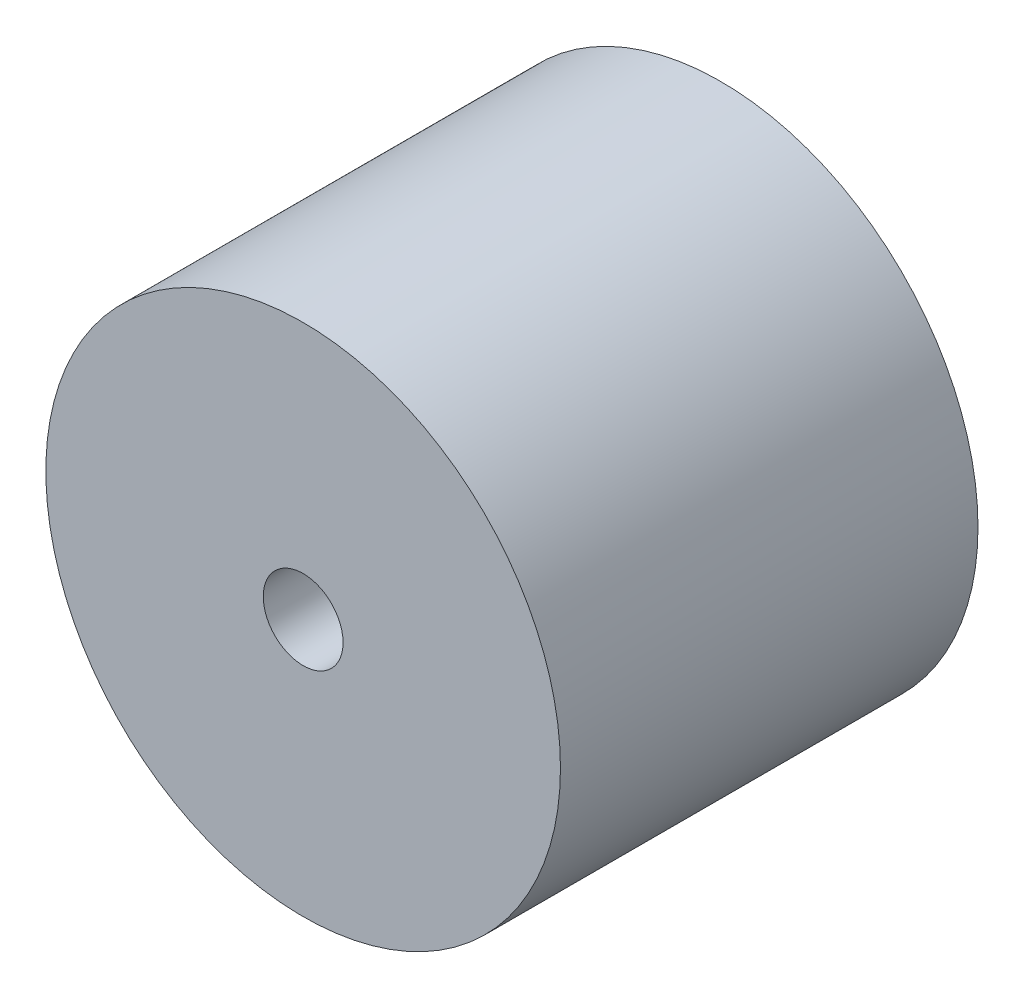
ISO-10303-21;
HEADER;
FILE_DESCRIPTION(('STEP AP214'),'2;1');
FILE_NAME('part.step','',(''),(''),'','','');
FILE_SCHEMA(('AUTOMOTIVE_DESIGN { 1 0 10303 214 1 1 1 1 }'));
ENDSEC;
DATA;
#1=APPLICATION_CONTEXT('core data for automotive mechanical design processes');
#2=APPLICATION_PROTOCOL_DEFINITION('international standard','automotive_design',2000,#1);
#3=PRODUCT_CONTEXT('',#1,'mechanical');
#4=PRODUCT('Part','Part','',(#3));
#5=PRODUCT_RELATED_PRODUCT_CATEGORY('part','',(#4));
#6=PRODUCT_DEFINITION_FORMATION('','',#4);
#7=PRODUCT_DEFINITION_CONTEXT('part definition',#1,'design');
#8=PRODUCT_DEFINITION('design','',#6,#7);
#9=PRODUCT_DEFINITION_SHAPE('','',#8);
#10=(LENGTH_UNIT() NAMED_UNIT(*) SI_UNIT(.MILLI.,.METRE.));
#11=(NAMED_UNIT(*) PLANE_ANGLE_UNIT() SI_UNIT($,.RADIAN.));
#12=(NAMED_UNIT(*) SI_UNIT($,.STERADIAN.) SOLID_ANGLE_UNIT());
#13=UNCERTAINTY_MEASURE_WITH_UNIT(LENGTH_MEASURE(1.E-05),#10,'distance_accuracy_value','');
#14=(GEOMETRIC_REPRESENTATION_CONTEXT(3) GLOBAL_UNCERTAINTY_ASSIGNED_CONTEXT((#13)) GLOBAL_UNIT_ASSIGNED_CONTEXT((#10,
#11,#12)) REPRESENTATION_CONTEXT('',''));
#15=CARTESIAN_POINT('',(0.,0.,0.));
#16=DIRECTION('',(0.,0.,1.));
#17=DIRECTION('',(1.,0.,0.));
#18=AXIS2_PLACEMENT_3D('',#15,#16,#17);
#19=CARTESIAN_POINT('',(0.,0.,43.));
#20=DIRECTION('',(0.,0.,1.));
#21=DIRECTION('',(1.,0.,0.));
#22=AXIS2_PLACEMENT_3D('',#19,#20,#21);
#23=PLANE('',#22);
#24=CARTESIAN_POINT('',(0.,0.,43.));
#25=DIRECTION('',(0.,0.,1.));
#26=DIRECTION('',(1.,0.,0.));
#27=AXIS2_PLACEMENT_3D('',#24,#25,#26);
#28=CIRCLE('',#27,26.5);
#29=CARTESIAN_POINT('',(26.5,0.,43.));
#30=VERTEX_POINT('',#29);
#31=EDGE_CURVE('E10',#30,#30,#28,.T.);
#32=ORIENTED_EDGE('',*,*,#31,.T.);
#33=EDGE_LOOP('',(#32));
#34=FACE_BOUND('',#33,.T.);
#35=CARTESIAN_POINT('',(0.,0.,43.));
#36=DIRECTION('',(0.,0.,1.));
#37=DIRECTION('',(1.,0.,0.));
#38=AXIS2_PLACEMENT_3D('',#35,#36,#37);
#39=CIRCLE('',#38,4.11);
#40=CARTESIAN_POINT('',(4.11,0.,43.));
#41=VERTEX_POINT('',#40);
#42=EDGE_CURVE('E48',#41,#41,#39,.T.);
#43=ORIENTED_EDGE('',*,*,#42,.F.);
#44=EDGE_LOOP('',(#43));
#45=FACE_BOUND('',#44,.T.);
#46=ADVANCED_FACE('F37',(#34,#45),#23,.T.);
#47=CARTESIAN_POINT('',(0.,0.,0.));
#48=DIRECTION('',(0.,0.,1.));
#49=DIRECTION('',(1.,0.,0.));
#50=AXIS2_PLACEMENT_3D('',#47,#48,#49);
#51=PLANE('',#50);
#52=CARTESIAN_POINT('',(0.,0.,0.));
#53=DIRECTION('',(0.,0.,1.));
#54=DIRECTION('',(1.,0.,0.));
#55=AXIS2_PLACEMENT_3D('',#52,#53,#54);
#56=CIRCLE('',#55,26.5);
#57=CARTESIAN_POINT('',(26.5,0.,0.));
#58=VERTEX_POINT('',#57);
#59=EDGE_CURVE('E41',#58,#58,#56,.T.);
#60=ORIENTED_EDGE('',*,*,#59,.F.);
#61=EDGE_LOOP('',(#60));
#62=FACE_BOUND('',#61,.T.);
#63=CARTESIAN_POINT('',(0.,0.,0.));
#64=DIRECTION('',(0.,0.,1.));
#65=DIRECTION('',(1.,0.,0.));
#66=AXIS2_PLACEMENT_3D('',#63,#64,#65);
#67=CIRCLE('',#66,4.11);
#68=CARTESIAN_POINT('',(4.11,0.,0.));
#69=VERTEX_POINT('',#68);
#70=EDGE_CURVE('E50',#69,#69,#67,.T.);
#71=ORIENTED_EDGE('',*,*,#70,.T.);
#72=EDGE_LOOP('',(#71));
#73=FACE_BOUND('',#72,.T.);
#74=ADVANCED_FACE('F60',(#62,#73),#51,.F.);
#75=CARTESIAN_POINT('',(0.,0.,43.));
#76=DIRECTION('',(0.,0.,-1.));
#77=DIRECTION('',(-1.,0.,0.));
#78=AXIS2_PLACEMENT_3D('',#75,#76,#77);
#79=CYLINDRICAL_SURFACE('',#78,26.5);
#80=ORIENTED_EDGE('',*,*,#31,.F.);
#81=EDGE_LOOP('',(#80));
#82=FACE_BOUND('',#81,.T.);
#83=ORIENTED_EDGE('',*,*,#59,.T.);
#84=EDGE_LOOP('',(#83));
#85=FACE_BOUND('',#84,.T.);
#86=ADVANCED_FACE('F39',(#82,#85),#79,.T.);
#87=CARTESIAN_POINT('',(0.,0.,43.));
#88=DIRECTION('',(0.,0.,-1.));
#89=DIRECTION('',(-1.,0.,0.));
#90=AXIS2_PLACEMENT_3D('',#87,#88,#89);
#91=CYLINDRICAL_SURFACE('',#90,4.11);
#92=ORIENTED_EDGE('',*,*,#42,.T.);
#93=EDGE_LOOP('',(#92));
#94=FACE_BOUND('',#93,.T.);
#95=ORIENTED_EDGE('',*,*,#70,.F.);
#96=EDGE_LOOP('',(#95));
#97=FACE_BOUND('',#96,.T.);
#98=ADVANCED_FACE('F56',(#94,#97),#91,.F.);
#99=CLOSED_SHELL('',(#46,#74,#86,#98));
#100=MANIFOLD_SOLID_BREP('B2',#99);
#101=ADVANCED_BREP_SHAPE_REPRESENTATION('',(#18,#100),#14);
#102=SHAPE_DEFINITION_REPRESENTATION(#9,#101);
ENDSEC;
END-ISO-10303-21;
